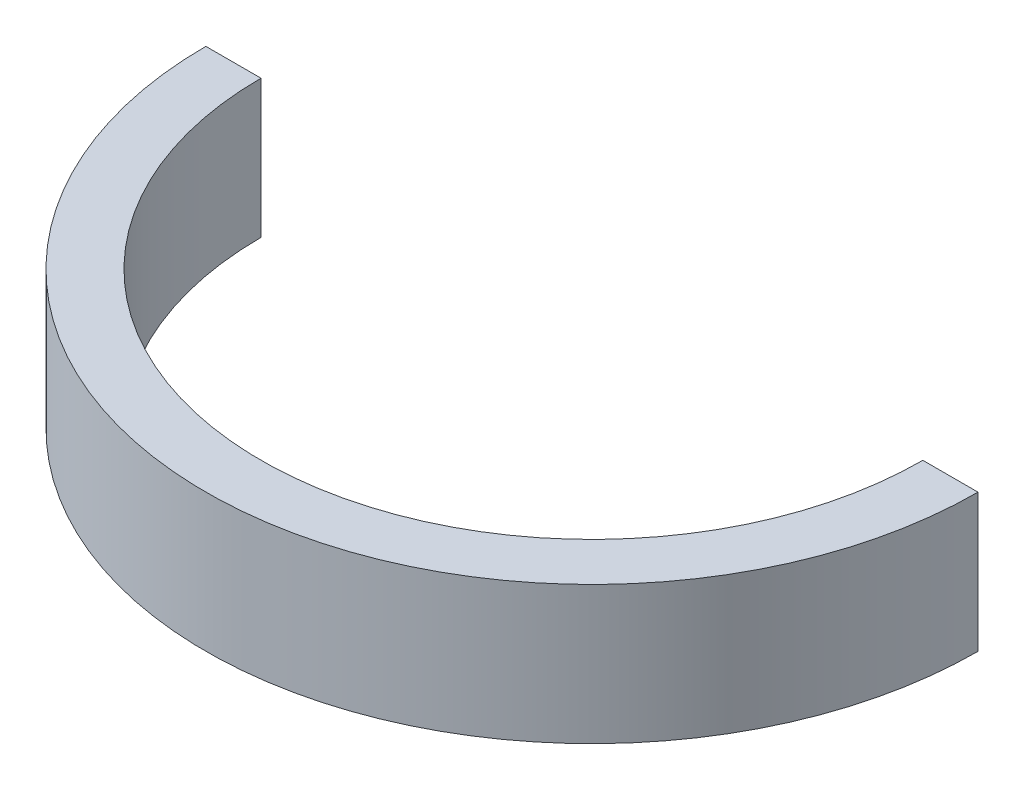
ISO-10303-21;
HEADER;
FILE_DESCRIPTION(('STEP AP214'),'2;1');
FILE_NAME('part.step','',(''),(''),'','','');
FILE_SCHEMA(('AUTOMOTIVE_DESIGN { 1 0 10303 214 1 1 1 1 }'));
ENDSEC;
DATA;
#1=APPLICATION_CONTEXT('core data for automotive mechanical design processes');
#2=APPLICATION_PROTOCOL_DEFINITION('international standard','automotive_design',2000,#1);
#3=PRODUCT_CONTEXT('',#1,'mechanical');
#4=PRODUCT('Part','Part','',(#3));
#5=PRODUCT_RELATED_PRODUCT_CATEGORY('part','',(#4));
#6=PRODUCT_DEFINITION_FORMATION('','',#4);
#7=PRODUCT_DEFINITION_CONTEXT('part definition',#1,'design');
#8=PRODUCT_DEFINITION('design','',#6,#7);
#9=PRODUCT_DEFINITION_SHAPE('','',#8);
#10=(LENGTH_UNIT() NAMED_UNIT(*) SI_UNIT(.MILLI.,.METRE.));
#11=(NAMED_UNIT(*) PLANE_ANGLE_UNIT() SI_UNIT($,.RADIAN.));
#12=(NAMED_UNIT(*) SI_UNIT($,.STERADIAN.) SOLID_ANGLE_UNIT());
#13=UNCERTAINTY_MEASURE_WITH_UNIT(LENGTH_MEASURE(1.E-05),#10,'distance_accuracy_value','');
#14=(GEOMETRIC_REPRESENTATION_CONTEXT(3) GLOBAL_UNCERTAINTY_ASSIGNED_CONTEXT((#13)) GLOBAL_UNIT_ASSIGNED_CONTEXT((#10,
#11,#12)) REPRESENTATION_CONTEXT('',''));
#15=CARTESIAN_POINT('',(0.,0.,0.));
#16=DIRECTION('',(0.,0.,1.));
#17=DIRECTION('',(1.,0.,0.));
#18=AXIS2_PLACEMENT_3D('',#15,#16,#17);
#19=CARTESIAN_POINT('',(0.,20.,0.));
#20=DIRECTION('',(0.,-1.,0.));
#21=DIRECTION('',(0.,0.,-1.));
#22=AXIS2_PLACEMENT_3D('',#19,#20,#21);
#23=CYLINDRICAL_SURFACE('',#22,48.);
#24=CARTESIAN_POINT('',(0.,0.,0.));
#25=DIRECTION('',(0.,-1.,0.));
#26=DIRECTION('',(0.,0.,1.));
#27=AXIS2_PLACEMENT_3D('',#24,#25,#26);
#28=CIRCLE('',#27,48.);
#29=CARTESIAN_POINT('',(48.,0.,0.));
#30=VERTEX_POINT('',#29);
#31=CARTESIAN_POINT('',(-48.,0.,0.));
#32=VERTEX_POINT('',#31);
#33=EDGE_CURVE('E107',#30,#32,#28,.T.);
#34=ORIENTED_EDGE('',*,*,#33,.T.);
#35=DIRECTION('',(0.,-1.,0.));
#36=VECTOR('',#35,1.);
#37=CARTESIAN_POINT('',(-48.,20.,0.));
#38=LINE('',#37,#36);
#39=CARTESIAN_POINT('',(-48.,20.,0.));
#40=VERTEX_POINT('',#39);
#41=EDGE_CURVE('E11',#40,#32,#38,.T.);
#42=ORIENTED_EDGE('',*,*,#41,.F.);
#43=CARTESIAN_POINT('',(0.,20.,0.));
#44=DIRECTION('',(0.,-1.,0.));
#45=DIRECTION('',(0.,0.,1.));
#46=AXIS2_PLACEMENT_3D('',#43,#44,#45);
#47=CIRCLE('',#46,48.);
#48=CARTESIAN_POINT('',(48.,20.,0.));
#49=VERTEX_POINT('',#48);
#50=EDGE_CURVE('E91',#49,#40,#47,.T.);
#51=ORIENTED_EDGE('',*,*,#50,.F.);
#52=DIRECTION('',(0.,-1.,0.));
#53=VECTOR('',#52,1.);
#54=CARTESIAN_POINT('',(48.,20.,0.));
#55=LINE('',#54,#53);
#56=EDGE_CURVE('E103',#49,#30,#55,.T.);
#57=ORIENTED_EDGE('',*,*,#56,.T.);
#58=EDGE_LOOP('',(#34,#42,#51,#57));
#59=FACE_BOUND('',#58,.T.);
#60=ADVANCED_FACE('F39',(#59),#23,.F.);
#61=CARTESIAN_POINT('',(-56.,20.,0.));
#62=DIRECTION('',(0.,0.,1.));
#63=DIRECTION('',(1.,0.,0.));
#64=AXIS2_PLACEMENT_3D('',#61,#62,#63);
#65=PLANE('',#64);
#66=DIRECTION('',(-1.,0.,0.));
#67=VECTOR('',#66,1.);
#68=CARTESIAN_POINT('',(-56.,0.,0.));
#69=LINE('',#68,#67);
#70=CARTESIAN_POINT('',(-56.,0.,0.));
#71=VERTEX_POINT('',#70);
#72=EDGE_CURVE('E96',#32,#71,#69,.T.);
#73=ORIENTED_EDGE('',*,*,#72,.T.);
#74=DIRECTION('',(0.,-1.,0.));
#75=VECTOR('',#74,1.);
#76=CARTESIAN_POINT('',(-56.,20.,0.));
#77=LINE('',#76,#75);
#78=CARTESIAN_POINT('',(-56.,20.,0.));
#79=VERTEX_POINT('',#78);
#80=EDGE_CURVE('E48',#79,#71,#77,.T.);
#81=ORIENTED_EDGE('',*,*,#80,.F.);
#82=DIRECTION('',(-1.,0.,0.));
#83=VECTOR('',#82,1.);
#84=CARTESIAN_POINT('',(-56.,20.,0.));
#85=LINE('',#84,#83);
#86=EDGE_CURVE('E86',#40,#79,#85,.T.);
#87=ORIENTED_EDGE('',*,*,#86,.F.);
#88=ORIENTED_EDGE('',*,*,#41,.T.);
#89=EDGE_LOOP('',(#73,#81,#87,#88));
#90=FACE_BOUND('',#89,.T.);
#91=ADVANCED_FACE('F95',(#90),#65,.F.);
#92=CARTESIAN_POINT('',(0.,20.,0.));
#93=DIRECTION('',(0.,-1.,0.));
#94=DIRECTION('',(0.,0.,-1.));
#95=AXIS2_PLACEMENT_3D('',#92,#93,#94);
#96=CYLINDRICAL_SURFACE('',#95,56.);
#97=CARTESIAN_POINT('',(0.,0.,0.));
#98=DIRECTION('',(0.,1.,0.));
#99=DIRECTION('',(0.,0.,1.));
#100=AXIS2_PLACEMENT_3D('',#97,#98,#99);
#101=CIRCLE('',#100,56.);
#102=CARTESIAN_POINT('',(56.,0.,0.));
#103=VERTEX_POINT('',#102);
#104=EDGE_CURVE('E73',#71,#103,#101,.T.);
#105=ORIENTED_EDGE('',*,*,#104,.T.);
#106=DIRECTION('',(0.,-1.,0.));
#107=VECTOR('',#106,1.);
#108=CARTESIAN_POINT('',(56.,20.,0.));
#109=LINE('',#108,#107);
#110=CARTESIAN_POINT('',(56.,20.,0.));
#111=VERTEX_POINT('',#110);
#112=EDGE_CURVE('E98',#111,#103,#109,.T.);
#113=ORIENTED_EDGE('',*,*,#112,.F.);
#114=CARTESIAN_POINT('',(0.,20.,0.));
#115=DIRECTION('',(0.,1.,0.));
#116=DIRECTION('',(0.,0.,1.));
#117=AXIS2_PLACEMENT_3D('',#114,#115,#116);
#118=CIRCLE('',#117,56.);
#119=EDGE_CURVE('E89',#79,#111,#118,.T.);
#120=ORIENTED_EDGE('',*,*,#119,.F.);
#121=ORIENTED_EDGE('',*,*,#80,.T.);
#122=EDGE_LOOP('',(#105,#113,#120,#121));
#123=FACE_BOUND('',#122,.T.);
#124=ADVANCED_FACE('F99',(#123),#96,.T.);
#125=CARTESIAN_POINT('',(48.,20.,0.));
#126=DIRECTION('',(0.,0.,1.));
#127=DIRECTION('',(1.,0.,0.));
#128=AXIS2_PLACEMENT_3D('',#125,#126,#127);
#129=PLANE('',#128);
#130=DIRECTION('',(-1.,0.,0.));
#131=VECTOR('',#130,1.);
#132=CARTESIAN_POINT('',(48.,0.,0.));
#133=LINE('',#132,#131);
#134=EDGE_CURVE('E79',#103,#30,#133,.T.);
#135=ORIENTED_EDGE('',*,*,#134,.T.);
#136=ORIENTED_EDGE('',*,*,#56,.F.);
#137=DIRECTION('',(-1.,0.,0.));
#138=VECTOR('',#137,1.);
#139=CARTESIAN_POINT('',(48.,20.,0.));
#140=LINE('',#139,#138);
#141=EDGE_CURVE('E56',#111,#49,#140,.T.);
#142=ORIENTED_EDGE('',*,*,#141,.F.);
#143=ORIENTED_EDGE('',*,*,#112,.T.);
#144=EDGE_LOOP('',(#135,#136,#142,#143));
#145=FACE_BOUND('',#144,.T.);
#146=ADVANCED_FACE('F120',(#145),#129,.F.);
#147=CARTESIAN_POINT('',(0.,20.,0.));
#148=DIRECTION('',(0.,1.,0.));
#149=DIRECTION('',(0.,0.,1.));
#150=AXIS2_PLACEMENT_3D('',#147,#148,#149);
#151=PLANE('',#150);
#152=ORIENTED_EDGE('',*,*,#50,.T.);
#153=ORIENTED_EDGE('',*,*,#86,.T.);
#154=ORIENTED_EDGE('',*,*,#119,.T.);
#155=ORIENTED_EDGE('',*,*,#141,.T.);
#156=EDGE_LOOP('',(#152,#153,#154,#155));
#157=FACE_BOUND('',#156,.T.);
#158=ADVANCED_FACE('F87',(#157),#151,.T.);
#159=CARTESIAN_POINT('',(0.,0.,0.));
#160=DIRECTION('',(0.,1.,0.));
#161=DIRECTION('',(0.,0.,1.));
#162=AXIS2_PLACEMENT_3D('',#159,#160,#161);
#163=PLANE('',#162);
#164=ORIENTED_EDGE('',*,*,#33,.F.);
#165=ORIENTED_EDGE('',*,*,#134,.F.);
#166=ORIENTED_EDGE('',*,*,#104,.F.);
#167=ORIENTED_EDGE('',*,*,#72,.F.);
#168=EDGE_LOOP('',(#164,#165,#166,#167));
#169=FACE_BOUND('',#168,.T.);
#170=ADVANCED_FACE('F123',(#169),#163,.F.);
#171=CLOSED_SHELL('',(#60,#91,#124,#146,#158,#170));
#172=MANIFOLD_SOLID_BREP('B2',#171);
#173=ADVANCED_BREP_SHAPE_REPRESENTATION('',(#18,#172),#14);
#174=SHAPE_DEFINITION_REPRESENTATION(#9,#173);
ENDSEC;
END-ISO-10303-21;
